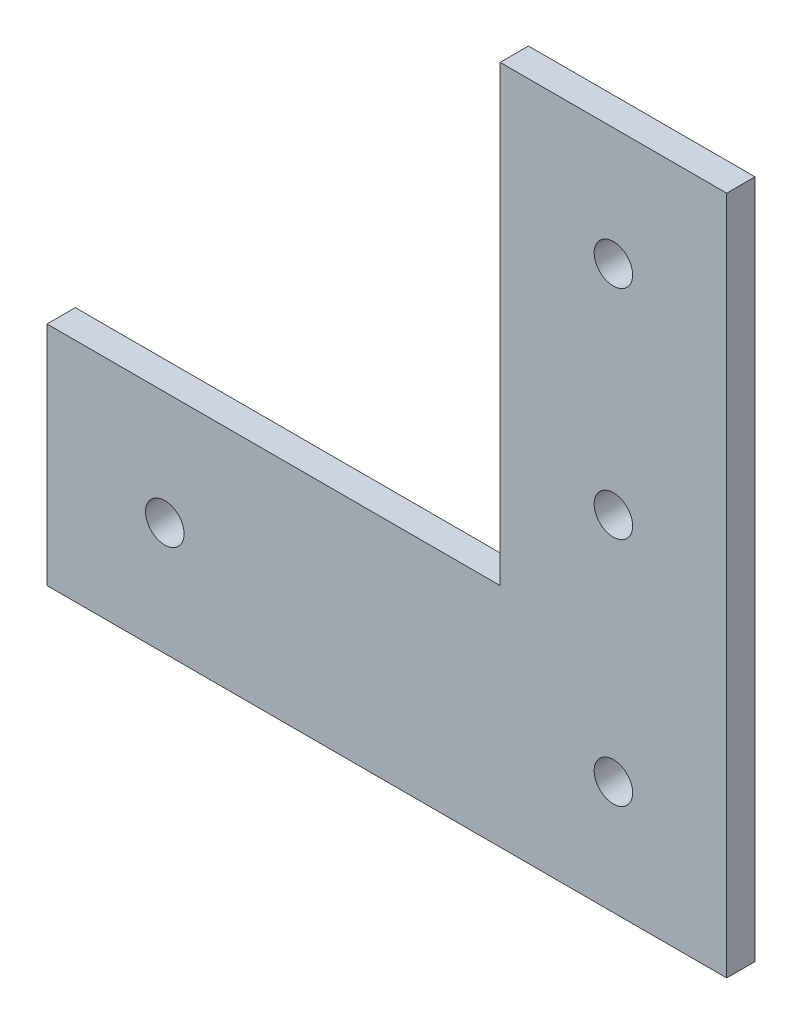
ISO-10303-21;
HEADER;
FILE_DESCRIPTION(('STEP AP214'),'2;1');
FILE_NAME('part.step','',(''),(''),'','','');
FILE_SCHEMA(('AUTOMOTIVE_DESIGN { 1 0 10303 214 1 1 1 1 }'));
ENDSEC;
DATA;
#1=APPLICATION_CONTEXT('core data for automotive mechanical design processes');
#2=APPLICATION_PROTOCOL_DEFINITION('international standard','automotive_design',2000,#1);
#3=PRODUCT_CONTEXT('',#1,'mechanical');
#4=PRODUCT('Part','Part','',(#3));
#5=PRODUCT_RELATED_PRODUCT_CATEGORY('part','',(#4));
#6=PRODUCT_DEFINITION_FORMATION('','',#4);
#7=PRODUCT_DEFINITION_CONTEXT('part definition',#1,'design');
#8=PRODUCT_DEFINITION('design','',#6,#7);
#9=PRODUCT_DEFINITION_SHAPE('','',#8);
#10=(LENGTH_UNIT() NAMED_UNIT(*) SI_UNIT(.MILLI.,.METRE.));
#11=(NAMED_UNIT(*) PLANE_ANGLE_UNIT() SI_UNIT($,.RADIAN.));
#12=(NAMED_UNIT(*) SI_UNIT($,.STERADIAN.) SOLID_ANGLE_UNIT());
#13=UNCERTAINTY_MEASURE_WITH_UNIT(LENGTH_MEASURE(1.E-05),#10,'distance_accuracy_value','');
#14=(GEOMETRIC_REPRESENTATION_CONTEXT(3) GLOBAL_UNCERTAINTY_ASSIGNED_CONTEXT((#13)) GLOBAL_UNIT_ASSIGNED_CONTEXT((#10,
#11,#12)) REPRESENTATION_CONTEXT('',''));
#15=CARTESIAN_POINT('',(0.,0.,0.));
#16=DIRECTION('',(0.,0.,1.));
#17=DIRECTION('',(1.,0.,0.));
#18=AXIS2_PLACEMENT_3D('',#15,#16,#17);
#19=CARTESIAN_POINT('',(38.1,-38.1,3.175));
#20=DIRECTION('',(-1.,0.,0.));
#21=DIRECTION('',(0.,0.,1.));
#22=AXIS2_PLACEMENT_3D('',#19,#20,#21);
#23=PLANE('',#22);
#24=DIRECTION('',(0.,1.,0.));
#25=VECTOR('',#24,1.);
#26=CARTESIAN_POINT('',(38.1,-38.1,0.));
#27=LINE('',#26,#25);
#28=CARTESIAN_POINT('',(38.1,-38.1,0.));
#29=VERTEX_POINT('',#28);
#30=CARTESIAN_POINT('',(38.1,38.1,0.));
#31=VERTEX_POINT('',#30);
#32=EDGE_CURVE('E120',#29,#31,#27,.T.);
#33=ORIENTED_EDGE('',*,*,#32,.T.);
#34=DIRECTION('',(0.,0.,-1.));
#35=VECTOR('',#34,1.);
#36=CARTESIAN_POINT('',(38.1,38.1,3.175));
#37=LINE('',#36,#35);
#38=CARTESIAN_POINT('',(38.1,38.1,3.175));
#39=VERTEX_POINT('',#38);
#40=EDGE_CURVE('E11',#39,#31,#37,.T.);
#41=ORIENTED_EDGE('',*,*,#40,.F.);
#42=DIRECTION('',(0.,1.,0.));
#43=VECTOR('',#42,1.);
#44=CARTESIAN_POINT('',(38.1,-38.1,3.175));
#45=LINE('',#44,#43);
#46=CARTESIAN_POINT('',(38.1,-38.1,3.175));
#47=VERTEX_POINT('',#46);
#48=EDGE_CURVE('E121',#47,#39,#45,.T.);
#49=ORIENTED_EDGE('',*,*,#48,.F.);
#50=DIRECTION('',(0.,0.,-1.));
#51=VECTOR('',#50,1.);
#52=CARTESIAN_POINT('',(38.1,-38.1,3.175));
#53=LINE('',#52,#51);
#54=EDGE_CURVE('E127',#47,#29,#53,.T.);
#55=ORIENTED_EDGE('',*,*,#54,.T.);
#56=EDGE_LOOP('',(#33,#41,#49,#55));
#57=FACE_BOUND('',#56,.T.);
#58=ADVANCED_FACE('F32',(#57),#23,.F.);
#59=CARTESIAN_POINT('',(-38.1,38.1,3.175));
#60=DIRECTION('',(0.,-1.,0.));
#61=DIRECTION('',(0.,0.,-1.));
#62=AXIS2_PLACEMENT_3D('',#59,#60,#61);
#63=PLANE('',#62);
#64=DIRECTION('',(-1.,0.,0.));
#65=VECTOR('',#64,1.);
#66=CARTESIAN_POINT('',(-38.1,38.1,0.));
#67=LINE('',#66,#65);
#68=CARTESIAN_POINT('',(12.7,38.1,0.));
#69=VERTEX_POINT('',#68);
#70=EDGE_CURVE('E130',#31,#69,#67,.T.);
#71=ORIENTED_EDGE('',*,*,#70,.T.);
#72=DIRECTION('',(0.,0.,-1.));
#73=VECTOR('',#72,1.);
#74=CARTESIAN_POINT('',(12.7,38.1,6.35));
#75=LINE('',#74,#73);
#76=CARTESIAN_POINT('',(12.7,38.1,3.175));
#77=VERTEX_POINT('',#76);
#78=EDGE_CURVE('E46',#77,#69,#75,.T.);
#79=ORIENTED_EDGE('',*,*,#78,.F.);
#80=DIRECTION('',(-1.,0.,0.));
#81=VECTOR('',#80,1.);
#82=CARTESIAN_POINT('',(-38.1,38.1,3.175));
#83=LINE('',#82,#81);
#84=EDGE_CURVE('E77',#39,#77,#83,.T.);
#85=ORIENTED_EDGE('',*,*,#84,.F.);
#86=ORIENTED_EDGE('',*,*,#40,.T.);
#87=EDGE_LOOP('',(#71,#79,#85,#86));
#88=FACE_BOUND('',#87,.T.);
#89=ADVANCED_FACE('F143',(#88),#63,.F.);
#90=CARTESIAN_POINT('',(-38.1,-38.1,3.175));
#91=DIRECTION('',(1.,0.,0.));
#92=DIRECTION('',(0.,0.,-1.));
#93=AXIS2_PLACEMENT_3D('',#90,#91,#92);
#94=PLANE('',#93);
#95=DIRECTION('',(0.,-1.,0.));
#96=VECTOR('',#95,1.);
#97=CARTESIAN_POINT('',(-38.1,-38.1,3.175));
#98=LINE('',#97,#96);
#99=CARTESIAN_POINT('',(-38.1,-12.7,3.175));
#100=VERTEX_POINT('',#99);
#101=CARTESIAN_POINT('',(-38.1,-38.1,3.175));
#102=VERTEX_POINT('',#101);
#103=EDGE_CURVE('E124',#100,#102,#98,.T.);
#104=ORIENTED_EDGE('',*,*,#103,.F.);
#105=DIRECTION('',(0.,0.,-1.));
#106=VECTOR('',#105,1.);
#107=CARTESIAN_POINT('',(-38.1,-12.7,6.35));
#108=LINE('',#107,#106);
#109=CARTESIAN_POINT('',(-38.1,-12.7,0.));
#110=VERTEX_POINT('',#109);
#111=EDGE_CURVE('E101',#100,#110,#108,.T.);
#112=ORIENTED_EDGE('',*,*,#111,.T.);
#113=DIRECTION('',(0.,-1.,0.));
#114=VECTOR('',#113,1.);
#115=CARTESIAN_POINT('',(-38.1,-38.1,0.));
#116=LINE('',#115,#114);
#117=CARTESIAN_POINT('',(-38.1,-38.1,0.));
#118=VERTEX_POINT('',#117);
#119=EDGE_CURVE('E111',#110,#118,#116,.T.);
#120=ORIENTED_EDGE('',*,*,#119,.T.);
#121=DIRECTION('',(0.,0.,-1.));
#122=VECTOR('',#121,1.);
#123=CARTESIAN_POINT('',(-38.1,-38.1,3.175));
#124=LINE('',#123,#122);
#125=EDGE_CURVE('E39',#102,#118,#124,.T.);
#126=ORIENTED_EDGE('',*,*,#125,.F.);
#127=EDGE_LOOP('',(#104,#112,#120,#126));
#128=FACE_BOUND('',#127,.T.);
#129=ADVANCED_FACE('F145',(#128),#94,.F.);
#130=CARTESIAN_POINT('',(-38.1,-38.1,3.175));
#131=DIRECTION('',(0.,1.,0.));
#132=DIRECTION('',(0.,0.,1.));
#133=AXIS2_PLACEMENT_3D('',#130,#131,#132);
#134=PLANE('',#133);
#135=DIRECTION('',(1.,0.,0.));
#136=VECTOR('',#135,1.);
#137=CARTESIAN_POINT('',(-38.1,-38.1,0.));
#138=LINE('',#137,#136);
#139=EDGE_CURVE('E72',#118,#29,#138,.T.);
#140=ORIENTED_EDGE('',*,*,#139,.T.);
#141=ORIENTED_EDGE('',*,*,#54,.F.);
#142=DIRECTION('',(1.,0.,0.));
#143=VECTOR('',#142,1.);
#144=CARTESIAN_POINT('',(-38.1,-38.1,3.175));
#145=LINE('',#144,#143);
#146=EDGE_CURVE('E55',#102,#47,#145,.T.);
#147=ORIENTED_EDGE('',*,*,#146,.F.);
#148=ORIENTED_EDGE('',*,*,#125,.T.);
#149=EDGE_LOOP('',(#140,#141,#147,#148));
#150=FACE_BOUND('',#149,.T.);
#151=ADVANCED_FACE('F135',(#150),#134,.F.);
#152=CARTESIAN_POINT('',(0.,0.,3.175));
#153=DIRECTION('',(0.,0.,-1.));
#154=DIRECTION('',(-1.,0.,0.));
#155=AXIS2_PLACEMENT_3D('',#152,#153,#154);
#156=PLANE('',#155);
#157=CARTESIAN_POINT('',(25.4,0.507999999999996,3.175));
#158=DIRECTION('',(0.,0.,1.));
#159=DIRECTION('',(1.,0.,0.));
#160=AXIS2_PLACEMENT_3D('',#157,#158,#159);
#161=CIRCLE('',#160,2.159);
#162=CARTESIAN_POINT('',(27.559,0.507999999999996,3.175));
#163=VERTEX_POINT('',#162);
#164=EDGE_CURVE('E187',#163,#163,#161,.T.);
#165=ORIENTED_EDGE('',*,*,#164,.F.);
#166=EDGE_LOOP('',(#165));
#167=FACE_BOUND('',#166,.T.);
#168=CARTESIAN_POINT('',(25.4,24.892,3.175));
#169=DIRECTION('',(0.,0.,1.));
#170=DIRECTION('',(1.,0.,0.));
#171=AXIS2_PLACEMENT_3D('',#168,#169,#170);
#172=CIRCLE('',#171,2.159);
#173=CARTESIAN_POINT('',(27.559,24.892,3.175));
#174=VERTEX_POINT('',#173);
#175=EDGE_CURVE('E193',#174,#174,#172,.T.);
#176=ORIENTED_EDGE('',*,*,#175,.F.);
#177=EDGE_LOOP('',(#176));
#178=FACE_BOUND('',#177,.T.);
#179=CARTESIAN_POINT('',(-24.892,-25.4,3.175));
#180=DIRECTION('',(0.,0.,-1.));
#181=DIRECTION('',(-1.,0.,0.));
#182=AXIS2_PLACEMENT_3D('',#179,#180,#181);
#183=CIRCLE('',#182,2.159);
#184=CARTESIAN_POINT('',(-27.051,-25.4,3.175));
#185=VERTEX_POINT('',#184);
#186=EDGE_CURVE('E200',#185,#185,#183,.T.);
#187=ORIENTED_EDGE('',*,*,#186,.T.);
#188=EDGE_LOOP('',(#187));
#189=FACE_BOUND('',#188,.T.);
#190=CARTESIAN_POINT('',(25.4,-25.4,3.175));
#191=DIRECTION('',(0.,0.,-1.));
#192=DIRECTION('',(-1.,0.,0.));
#193=AXIS2_PLACEMENT_3D('',#190,#191,#192);
#194=CIRCLE('',#193,2.159);
#195=CARTESIAN_POINT('',(23.241,-25.4,3.175));
#196=VERTEX_POINT('',#195);
#197=EDGE_CURVE('E107',#196,#196,#194,.T.);
#198=ORIENTED_EDGE('',*,*,#197,.T.);
#199=EDGE_LOOP('',(#198));
#200=FACE_BOUND('',#199,.T.);
#201=DIRECTION('',(0.,-1.,0.));
#202=VECTOR('',#201,1.);
#203=CARTESIAN_POINT('',(12.7,0.,3.175));
#204=LINE('',#203,#202);
#205=CARTESIAN_POINT('',(12.7,-12.7,3.175));
#206=VERTEX_POINT('',#205);
#207=EDGE_CURVE('E116',#77,#206,#204,.T.);
#208=ORIENTED_EDGE('',*,*,#207,.T.);
#209=DIRECTION('',(-1.,0.,0.));
#210=VECTOR('',#209,1.);
#211=CARTESIAN_POINT('',(0.,-12.7,3.175));
#212=LINE('',#211,#210);
#213=EDGE_CURVE('E99',#206,#100,#212,.T.);
#214=ORIENTED_EDGE('',*,*,#213,.T.);
#215=ORIENTED_EDGE('',*,*,#103,.T.);
#216=ORIENTED_EDGE('',*,*,#146,.T.);
#217=ORIENTED_EDGE('',*,*,#48,.T.);
#218=ORIENTED_EDGE('',*,*,#84,.T.);
#219=EDGE_LOOP('',(#208,#214,#215,#216,#217,#218));
#220=FACE_BOUND('',#219,.T.);
#221=ADVANCED_FACE('F142',(#167,#178,#189,#200,#220),#156,.F.);
#222=CARTESIAN_POINT('',(0.,0.,0.));
#223=DIRECTION('',(0.,0.,-1.));
#224=DIRECTION('',(-1.,0.,0.));
#225=AXIS2_PLACEMENT_3D('',#222,#223,#224);
#226=PLANE('',#225);
#227=CARTESIAN_POINT('',(25.4,0.507999999999996,0.));
#228=DIRECTION('',(0.,0.,1.));
#229=DIRECTION('',(1.,0.,0.));
#230=AXIS2_PLACEMENT_3D('',#227,#228,#229);
#231=CIRCLE('',#230,2.159);
#232=CARTESIAN_POINT('',(27.559,0.507999999999996,0.));
#233=VERTEX_POINT('',#232);
#234=EDGE_CURVE('E184',#233,#233,#231,.T.);
#235=ORIENTED_EDGE('',*,*,#234,.T.);
#236=EDGE_LOOP('',(#235));
#237=FACE_BOUND('',#236,.T.);
#238=CARTESIAN_POINT('',(25.4,24.892,0.));
#239=DIRECTION('',(0.,0.,1.));
#240=DIRECTION('',(1.,0.,0.));
#241=AXIS2_PLACEMENT_3D('',#238,#239,#240);
#242=CIRCLE('',#241,2.159);
#243=CARTESIAN_POINT('',(27.559,24.892,0.));
#244=VERTEX_POINT('',#243);
#245=EDGE_CURVE('E188',#244,#244,#242,.T.);
#246=ORIENTED_EDGE('',*,*,#245,.T.);
#247=EDGE_LOOP('',(#246));
#248=FACE_BOUND('',#247,.T.);
#249=CARTESIAN_POINT('',(-24.892,-25.4,0.));
#250=DIRECTION('',(0.,0.,-1.));
#251=DIRECTION('',(-1.,0.,0.));
#252=AXIS2_PLACEMENT_3D('',#249,#250,#251);
#253=CIRCLE('',#252,2.159);
#254=CARTESIAN_POINT('',(-27.051,-25.4,0.));
#255=VERTEX_POINT('',#254);
#256=EDGE_CURVE('E190',#255,#255,#253,.T.);
#257=ORIENTED_EDGE('',*,*,#256,.F.);
#258=EDGE_LOOP('',(#257));
#259=FACE_BOUND('',#258,.T.);
#260=CARTESIAN_POINT('',(25.4,-25.4,0.));
#261=DIRECTION('',(0.,0.,-1.));
#262=DIRECTION('',(-1.,0.,0.));
#263=AXIS2_PLACEMENT_3D('',#260,#261,#262);
#264=CIRCLE('',#263,2.159);
#265=CARTESIAN_POINT('',(23.241,-25.4,0.));
#266=VERTEX_POINT('',#265);
#267=EDGE_CURVE('E203',#266,#266,#264,.T.);
#268=ORIENTED_EDGE('',*,*,#267,.F.);
#269=EDGE_LOOP('',(#268));
#270=FACE_BOUND('',#269,.T.);
#271=DIRECTION('',(-1.,0.,0.));
#272=VECTOR('',#271,1.);
#273=CARTESIAN_POINT('',(-38.1,-12.7,0.));
#274=LINE('',#273,#272);
#275=CARTESIAN_POINT('',(12.7,-12.7,0.));
#276=VERTEX_POINT('',#275);
#277=EDGE_CURVE('E96',#276,#110,#274,.T.);
#278=ORIENTED_EDGE('',*,*,#277,.F.);
#279=DIRECTION('',(0.,-1.,0.));
#280=VECTOR('',#279,1.);
#281=CARTESIAN_POINT('',(12.7,38.1,0.));
#282=LINE('',#281,#280);
#283=EDGE_CURVE('E103',#69,#276,#282,.T.);
#284=ORIENTED_EDGE('',*,*,#283,.F.);
#285=ORIENTED_EDGE('',*,*,#70,.F.);
#286=ORIENTED_EDGE('',*,*,#32,.F.);
#287=ORIENTED_EDGE('',*,*,#139,.F.);
#288=ORIENTED_EDGE('',*,*,#119,.F.);
#289=EDGE_LOOP('',(#278,#284,#285,#286,#287,#288));
#290=FACE_BOUND('',#289,.T.);
#291=ADVANCED_FACE('F110',(#237,#248,#259,#270,#290),#226,.T.);
#292=CARTESIAN_POINT('',(-38.1,-12.7,6.35));
#293=DIRECTION('',(0.,-1.,0.));
#294=DIRECTION('',(1.,0.,0.));
#295=AXIS2_PLACEMENT_3D('',#292,#293,#294);
#296=PLANE('',#295);
#297=DIRECTION('',(0.,0.,-1.));
#298=VECTOR('',#297,1.);
#299=CARTESIAN_POINT('',(12.7,-12.7,6.35));
#300=LINE('',#299,#298);
#301=EDGE_CURVE('E93',#206,#276,#300,.T.);
#302=ORIENTED_EDGE('',*,*,#301,.T.);
#303=ORIENTED_EDGE('',*,*,#277,.T.);
#304=ORIENTED_EDGE('',*,*,#111,.F.);
#305=ORIENTED_EDGE('',*,*,#213,.F.);
#306=EDGE_LOOP('',(#302,#303,#304,#305));
#307=FACE_BOUND('',#306,.T.);
#308=ADVANCED_FACE('F94',(#307),#296,.F.);
#309=CARTESIAN_POINT('',(12.7,38.1,6.35));
#310=DIRECTION('',(1.,0.,0.));
#311=DIRECTION('',(0.,1.,0.));
#312=AXIS2_PLACEMENT_3D('',#309,#310,#311);
#313=PLANE('',#312);
#314=ORIENTED_EDGE('',*,*,#78,.T.);
#315=ORIENTED_EDGE('',*,*,#283,.T.);
#316=ORIENTED_EDGE('',*,*,#301,.F.);
#317=ORIENTED_EDGE('',*,*,#207,.F.);
#318=EDGE_LOOP('',(#314,#315,#316,#317));
#319=FACE_BOUND('',#318,.T.);
#320=ADVANCED_FACE('F104',(#319),#313,.F.);
#321=CARTESIAN_POINT('',(25.4,-25.4,6.35));
#322=DIRECTION('',(0.,0.,-1.));
#323=DIRECTION('',(-1.,0.,0.));
#324=AXIS2_PLACEMENT_3D('',#321,#322,#323);
#325=CYLINDRICAL_SURFACE('',#324,2.159);
#326=ORIENTED_EDGE('',*,*,#267,.T.);
#327=EDGE_LOOP('',(#326));
#328=FACE_BOUND('',#327,.T.);
#329=ORIENTED_EDGE('',*,*,#197,.F.);
#330=EDGE_LOOP('',(#329));
#331=FACE_BOUND('',#330,.T.);
#332=ADVANCED_FACE('F162',(#328,#331),#325,.F.);
#333=CARTESIAN_POINT('',(-24.892,-25.4,6.35));
#334=DIRECTION('',(0.,0.,-1.));
#335=DIRECTION('',(-1.,0.,0.));
#336=AXIS2_PLACEMENT_3D('',#333,#334,#335);
#337=CYLINDRICAL_SURFACE('',#336,2.159);
#338=ORIENTED_EDGE('',*,*,#256,.T.);
#339=EDGE_LOOP('',(#338));
#340=FACE_BOUND('',#339,.T.);
#341=ORIENTED_EDGE('',*,*,#186,.F.);
#342=EDGE_LOOP('',(#341));
#343=FACE_BOUND('',#342,.T.);
#344=ADVANCED_FACE('F167',(#340,#343),#337,.F.);
#345=CARTESIAN_POINT('',(25.4,24.892,0.));
#346=DIRECTION('',(0.,0.,1.));
#347=DIRECTION('',(1.,0.,0.));
#348=AXIS2_PLACEMENT_3D('',#345,#346,#347);
#349=CYLINDRICAL_SURFACE('',#348,2.159);
#350=ORIENTED_EDGE('',*,*,#245,.F.);
#351=EDGE_LOOP('',(#350));
#352=FACE_BOUND('',#351,.T.);
#353=ORIENTED_EDGE('',*,*,#175,.T.);
#354=EDGE_LOOP('',(#353));
#355=FACE_BOUND('',#354,.T.);
#356=ADVANCED_FACE('F171',(#352,#355),#349,.F.);
#357=CARTESIAN_POINT('',(25.4,0.507999999999996,0.));
#358=DIRECTION('',(0.,0.,1.));
#359=DIRECTION('',(1.,0.,0.));
#360=AXIS2_PLACEMENT_3D('',#357,#358,#359);
#361=CYLINDRICAL_SURFACE('',#360,2.159);
#362=ORIENTED_EDGE('',*,*,#234,.F.);
#363=EDGE_LOOP('',(#362));
#364=FACE_BOUND('',#363,.T.);
#365=ORIENTED_EDGE('',*,*,#164,.T.);
#366=EDGE_LOOP('',(#365));
#367=FACE_BOUND('',#366,.T.);
#368=ADVANCED_FACE('F175',(#364,#367),#361,.F.);
#369=CLOSED_SHELL('',(#58,#89,#129,#151,#221,#291,#308,#320,#332,#344,#356,#368));
#370=MANIFOLD_SOLID_BREP('B2',#369);
#371=ADVANCED_BREP_SHAPE_REPRESENTATION('',(#18,#370),#14);
#372=SHAPE_DEFINITION_REPRESENTATION(#9,#371);
ENDSEC;
END-ISO-10303-21;
